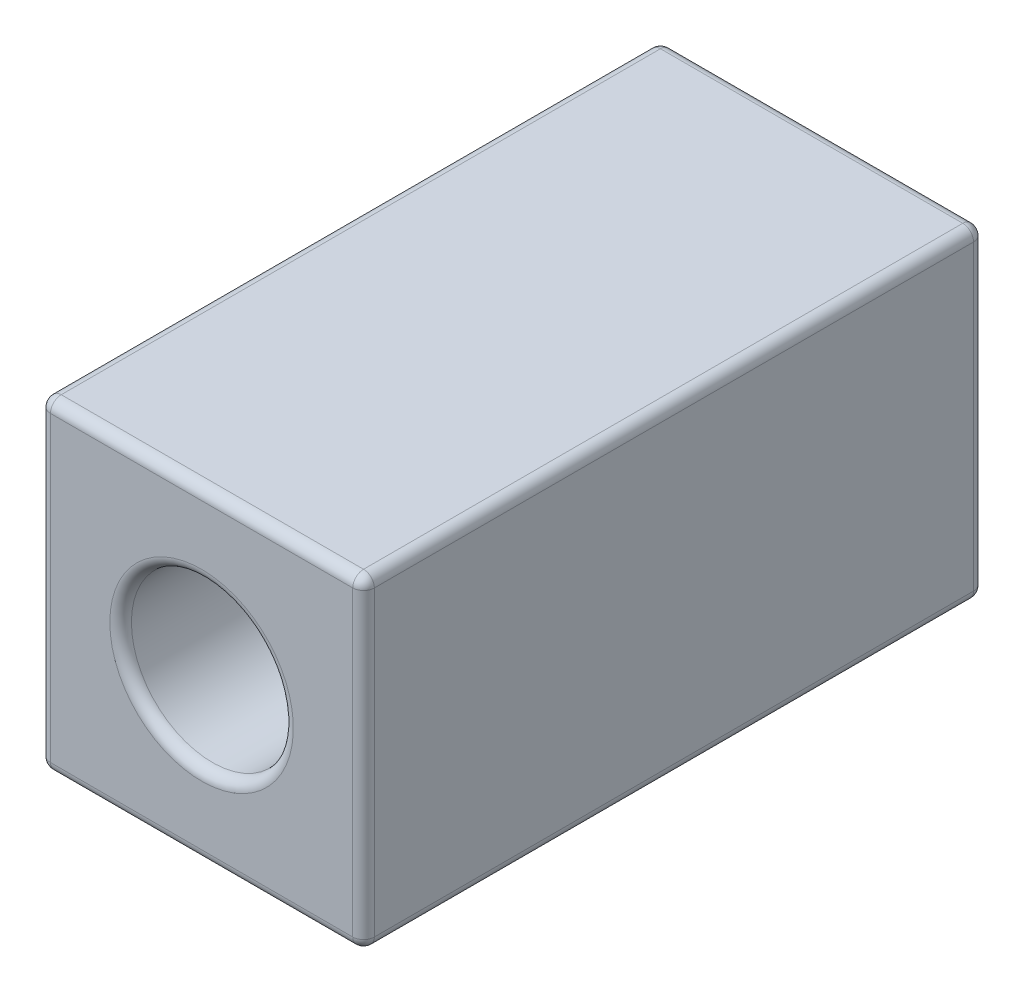
ISO-10303-21;
HEADER;
FILE_DESCRIPTION(('STEP AP214'),'2;1');
FILE_NAME('part.step','',(''),(''),'','','');
FILE_SCHEMA(('AUTOMOTIVE_DESIGN { 1 0 10303 214 1 1 1 1 }'));
ENDSEC;
DATA;
#1=APPLICATION_CONTEXT('core data for automotive mechanical design processes');
#2=APPLICATION_PROTOCOL_DEFINITION('international standard','automotive_design',2000,#1);
#3=PRODUCT_CONTEXT('',#1,'mechanical');
#4=PRODUCT('Part','Part','',(#3));
#5=PRODUCT_RELATED_PRODUCT_CATEGORY('part','',(#4));
#6=PRODUCT_DEFINITION_FORMATION('','',#4);
#7=PRODUCT_DEFINITION_CONTEXT('part definition',#1,'design');
#8=PRODUCT_DEFINITION('design','',#6,#7);
#9=PRODUCT_DEFINITION_SHAPE('','',#8);
#10=(LENGTH_UNIT() NAMED_UNIT(*) SI_UNIT(.MILLI.,.METRE.));
#11=(NAMED_UNIT(*) PLANE_ANGLE_UNIT() SI_UNIT($,.RADIAN.));
#12=(NAMED_UNIT(*) SI_UNIT($,.STERADIAN.) SOLID_ANGLE_UNIT());
#13=UNCERTAINTY_MEASURE_WITH_UNIT(LENGTH_MEASURE(1.E-05),#10,'distance_accuracy_value','');
#14=(GEOMETRIC_REPRESENTATION_CONTEXT(3) GLOBAL_UNCERTAINTY_ASSIGNED_CONTEXT((#13)) GLOBAL_UNIT_ASSIGNED_CONTEXT((#10,
#11,#12)) REPRESENTATION_CONTEXT('',''));
#15=CARTESIAN_POINT('',(0.,0.,0.));
#16=DIRECTION('',(0.,0.,1.));
#17=DIRECTION('',(1.,0.,0.));
#18=AXIS2_PLACEMENT_3D('',#15,#16,#17);
#19=CARTESIAN_POINT('',(-2.8,2.8,11.5));
#20=DIRECTION('',(0.,0.,-1.));
#21=DIRECTION('',(-1.,0.,0.));
#22=AXIS2_PLACEMENT_3D('',#19,#20,#21);
#23=PLANE('',#22);
#24=CARTESIAN_POINT('',(0.,0.,11.5));
#25=DIRECTION('',(0.,0.,-1.));
#26=DIRECTION('',(-1.,0.,0.));
#27=AXIS2_PLACEMENT_3D('',#24,#25,#26);
#28=CIRCLE('',#27,1.7);
#29=CARTESIAN_POINT('',(-1.7,0.,11.5));
#30=VERTEX_POINT('',#29);
#31=EDGE_CURVE('E11',#30,#30,#28,.T.);
#32=ORIENTED_EDGE('',*,*,#31,.T.);
#33=EDGE_LOOP('',(#32));
#34=FACE_BOUND('',#33,.T.);
#35=DIRECTION('',(0.,1.,0.));
#36=VECTOR('',#35,1.);
#37=CARTESIAN_POINT('',(2.8,2.8,11.5));
#38=LINE('',#37,#36);
#39=CARTESIAN_POINT('',(2.8,-2.8,11.5));
#40=VERTEX_POINT('',#39);
#41=CARTESIAN_POINT('',(2.8,2.8,11.5));
#42=VERTEX_POINT('',#41);
#43=EDGE_CURVE('E50',#40,#42,#38,.T.);
#44=ORIENTED_EDGE('',*,*,#43,.T.);
#45=DIRECTION('',(-1.,0.,0.));
#46=VECTOR('',#45,1.);
#47=CARTESIAN_POINT('',(-2.8,2.8,11.5));
#48=LINE('',#47,#46);
#49=CARTESIAN_POINT('',(-2.8,2.8,11.5));
#50=VERTEX_POINT('',#49);
#51=EDGE_CURVE('E43',#42,#50,#48,.T.);
#52=ORIENTED_EDGE('',*,*,#51,.T.);
#53=DIRECTION('',(0.,-1.,0.));
#54=VECTOR('',#53,1.);
#55=CARTESIAN_POINT('',(-2.8,2.8,11.5));
#56=LINE('',#55,#54);
#57=CARTESIAN_POINT('',(-2.8,-2.8,11.5));
#58=VERTEX_POINT('',#57);
#59=EDGE_CURVE('E205',#50,#58,#56,.T.);
#60=ORIENTED_EDGE('',*,*,#59,.T.);
#61=DIRECTION('',(1.,0.,0.));
#62=VECTOR('',#61,1.);
#63=CARTESIAN_POINT('',(-2.8,-2.8,11.5));
#64=LINE('',#63,#62);
#65=EDGE_CURVE('E55',#58,#40,#64,.T.);
#66=ORIENTED_EDGE('',*,*,#65,.T.);
#67=EDGE_LOOP('',(#44,#52,#60,#66));
#68=FACE_BOUND('',#67,.T.);
#69=ADVANCED_FACE('F35',(#34,#68),#23,.F.);
#70=CARTESIAN_POINT('',(-2.8,2.8,0.));
#71=DIRECTION('',(0.,0.,-1.));
#72=DIRECTION('',(-1.,0.,0.));
#73=AXIS2_PLACEMENT_3D('',#70,#71,#72);
#74=PLANE('',#73);
#75=CARTESIAN_POINT('',(0.,0.,0.));
#76=DIRECTION('',(0.,0.,-1.));
#77=DIRECTION('',(-1.,0.,0.));
#78=AXIS2_PLACEMENT_3D('',#75,#76,#77);
#79=CIRCLE('',#78,1.7);
#80=CARTESIAN_POINT('',(-1.7,0.,0.));
#81=VERTEX_POINT('',#80);
#82=EDGE_CURVE('E161',#81,#81,#79,.F.);
#83=ORIENTED_EDGE('',*,*,#82,.T.);
#84=EDGE_LOOP('',(#83));
#85=FACE_BOUND('',#84,.T.);
#86=DIRECTION('',(1.,0.,0.));
#87=VECTOR('',#86,1.);
#88=CARTESIAN_POINT('',(-2.8,-2.8,0.));
#89=LINE('',#88,#87);
#90=CARTESIAN_POINT('',(2.8,-2.8,0.));
#91=VERTEX_POINT('',#90);
#92=CARTESIAN_POINT('',(-2.8,-2.8,0.));
#93=VERTEX_POINT('',#92);
#94=EDGE_CURVE('E159',#91,#93,#89,.F.);
#95=ORIENTED_EDGE('',*,*,#94,.T.);
#96=DIRECTION('',(0.,-1.,0.));
#97=VECTOR('',#96,1.);
#98=CARTESIAN_POINT('',(-2.8,2.8,0.));
#99=LINE('',#98,#97);
#100=CARTESIAN_POINT('',(-2.8,2.8,0.));
#101=VERTEX_POINT('',#100);
#102=EDGE_CURVE('E129',#93,#101,#99,.F.);
#103=ORIENTED_EDGE('',*,*,#102,.T.);
#104=DIRECTION('',(-1.,0.,0.));
#105=VECTOR('',#104,1.);
#106=CARTESIAN_POINT('',(2.8,2.8,0.));
#107=LINE('',#106,#105);
#108=CARTESIAN_POINT('',(2.8,2.8,0.));
#109=VERTEX_POINT('',#108);
#110=EDGE_CURVE('E148',#101,#109,#107,.F.);
#111=ORIENTED_EDGE('',*,*,#110,.T.);
#112=DIRECTION('',(0.,1.,0.));
#113=VECTOR('',#112,1.);
#114=CARTESIAN_POINT('',(2.8,-2.8,0.));
#115=LINE('',#114,#113);
#116=EDGE_CURVE('E154',#109,#91,#115,.F.);
#117=ORIENTED_EDGE('',*,*,#116,.T.);
#118=EDGE_LOOP('',(#95,#103,#111,#117));
#119=FACE_BOUND('',#118,.T.);
#120=ADVANCED_FACE('F157',(#85,#119),#74,.T.);
#121=CARTESIAN_POINT('',(-2.8,2.8,11.5));
#122=DIRECTION('',(0.,0.,-1.));
#123=DIRECTION('',(-1.,0.,0.));
#124=AXIS2_PLACEMENT_3D('',#121,#122,#123);
#125=CYLINDRICAL_SURFACE('',#124,0.2);
#126=DIRECTION('',(0.,0.,-1.));
#127=VECTOR('',#126,1.);
#128=CARTESIAN_POINT('',(-2.8,3.,11.5));
#129=LINE('',#128,#127);
#130=CARTESIAN_POINT('',(-2.8,3.,11.3));
#131=VERTEX_POINT('',#130);
#132=CARTESIAN_POINT('',(-2.8,3.,0.200000000000001));
#133=VERTEX_POINT('',#132);
#134=EDGE_CURVE('E260',#131,#133,#129,.T.);
#135=ORIENTED_EDGE('',*,*,#134,.T.);
#136=CARTESIAN_POINT('',(-2.8,2.8,0.200000000000001));
#137=DIRECTION('',(0.,0.,-1.));
#138=DIRECTION('',(-1.,0.,0.));
#139=AXIS2_PLACEMENT_3D('',#136,#137,#138);
#140=CIRCLE('',#139,0.2);
#141=CARTESIAN_POINT('',(-3.,2.8,0.200000000000001));
#142=VERTEX_POINT('',#141);
#143=EDGE_CURVE('E142',#133,#142,#140,.F.);
#144=ORIENTED_EDGE('',*,*,#143,.T.);
#145=DIRECTION('',(0.,0.,-1.));
#146=VECTOR('',#145,1.);
#147=CARTESIAN_POINT('',(-3.,2.8,11.5));
#148=LINE('',#147,#146);
#149=CARTESIAN_POINT('',(-3.,2.8,11.3));
#150=VERTEX_POINT('',#149);
#151=EDGE_CURVE('E155',#150,#142,#148,.T.);
#152=ORIENTED_EDGE('',*,*,#151,.F.);
#153=CARTESIAN_POINT('',(-2.8,2.8,11.3));
#154=DIRECTION('',(0.,0.,-1.));
#155=DIRECTION('',(-1.,0.,0.));
#156=AXIS2_PLACEMENT_3D('',#153,#154,#155);
#157=CIRCLE('',#156,0.2);
#158=EDGE_CURVE('E202',#150,#131,#157,.T.);
#159=ORIENTED_EDGE('',*,*,#158,.T.);
#160=EDGE_LOOP('',(#135,#144,#152,#159));
#161=FACE_BOUND('',#160,.T.);
#162=ADVANCED_FACE('F37',(#161),#125,.T.);
#163=CARTESIAN_POINT('',(-3.,2.8,11.5));
#164=DIRECTION('',(1.,0.,0.));
#165=DIRECTION('',(0.,0.,-1.));
#166=AXIS2_PLACEMENT_3D('',#163,#164,#165);
#167=PLANE('',#166);
#168=ORIENTED_EDGE('',*,*,#151,.T.);
#169=DIRECTION('',(0.,-1.,0.));
#170=VECTOR('',#169,1.);
#171=CARTESIAN_POINT('',(-3.,-2.8,0.200000000000001));
#172=LINE('',#171,#170);
#173=CARTESIAN_POINT('',(-3.,-2.8,0.200000000000001));
#174=VERTEX_POINT('',#173);
#175=EDGE_CURVE('E132',#142,#174,#172,.T.);
#176=ORIENTED_EDGE('',*,*,#175,.T.);
#177=DIRECTION('',(0.,0.,-1.));
#178=VECTOR('',#177,1.);
#179=CARTESIAN_POINT('',(-3.,-2.8,11.5));
#180=LINE('',#179,#178);
#181=CARTESIAN_POINT('',(-3.,-2.8,11.3));
#182=VERTEX_POINT('',#181);
#183=EDGE_CURVE('E278',#182,#174,#180,.T.);
#184=ORIENTED_EDGE('',*,*,#183,.F.);
#185=DIRECTION('',(0.,-1.,0.));
#186=VECTOR('',#185,1.);
#187=CARTESIAN_POINT('',(-3.,2.8,11.3));
#188=LINE('',#187,#186);
#189=EDGE_CURVE('E174',#182,#150,#188,.F.);
#190=ORIENTED_EDGE('',*,*,#189,.T.);
#191=EDGE_LOOP('',(#168,#176,#184,#190));
#192=FACE_BOUND('',#191,.T.);
#193=ADVANCED_FACE('F301',(#192),#167,.F.);
#194=CARTESIAN_POINT('',(-2.8,-2.8,11.5));
#195=DIRECTION('',(0.,0.,-1.));
#196=DIRECTION('',(-1.,0.,0.));
#197=AXIS2_PLACEMENT_3D('',#194,#195,#196);
#198=CYLINDRICAL_SURFACE('',#197,0.2);
#199=ORIENTED_EDGE('',*,*,#183,.T.);
#200=CARTESIAN_POINT('',(-2.8,-2.8,0.200000000000001));
#201=DIRECTION('',(0.,0.,-1.));
#202=DIRECTION('',(-1.,0.,0.));
#203=AXIS2_PLACEMENT_3D('',#200,#201,#202);
#204=CIRCLE('',#203,0.2);
#205=CARTESIAN_POINT('',(-2.8,-3.,0.200000000000001));
#206=VERTEX_POINT('',#205);
#207=EDGE_CURVE('E179',#174,#206,#204,.F.);
#208=ORIENTED_EDGE('',*,*,#207,.T.);
#209=DIRECTION('',(0.,0.,-1.));
#210=VECTOR('',#209,1.);
#211=CARTESIAN_POINT('',(-2.8,-3.,11.5));
#212=LINE('',#211,#210);
#213=CARTESIAN_POINT('',(-2.8,-3.,11.3));
#214=VERTEX_POINT('',#213);
#215=EDGE_CURVE('E275',#214,#206,#212,.T.);
#216=ORIENTED_EDGE('',*,*,#215,.F.);
#217=CARTESIAN_POINT('',(-2.8,-2.8,11.3));
#218=DIRECTION('',(0.,0.,-1.));
#219=DIRECTION('',(-1.,0.,0.));
#220=AXIS2_PLACEMENT_3D('',#217,#218,#219);
#221=CIRCLE('',#220,0.2);
#222=EDGE_CURVE('E177',#214,#182,#221,.T.);
#223=ORIENTED_EDGE('',*,*,#222,.T.);
#224=EDGE_LOOP('',(#199,#208,#216,#223));
#225=FACE_BOUND('',#224,.T.);
#226=ADVANCED_FACE('F303',(#225),#198,.T.);
#227=CARTESIAN_POINT('',(-2.8,-3.,11.5));
#228=DIRECTION('',(0.,1.,0.));
#229=DIRECTION('',(0.,0.,1.));
#230=AXIS2_PLACEMENT_3D('',#227,#228,#229);
#231=PLANE('',#230);
#232=ORIENTED_EDGE('',*,*,#215,.T.);
#233=DIRECTION('',(1.,0.,0.));
#234=VECTOR('',#233,1.);
#235=CARTESIAN_POINT('',(2.8,-3.,0.200000000000001));
#236=LINE('',#235,#234);
#237=CARTESIAN_POINT('',(2.8,-3.,0.200000000000001));
#238=VERTEX_POINT('',#237);
#239=EDGE_CURVE('E183',#206,#238,#236,.T.);
#240=ORIENTED_EDGE('',*,*,#239,.T.);
#241=DIRECTION('',(0.,0.,-1.));
#242=VECTOR('',#241,1.);
#243=CARTESIAN_POINT('',(2.8,-3.,11.5));
#244=LINE('',#243,#242);
#245=CARTESIAN_POINT('',(2.8,-3.,11.3));
#246=VERTEX_POINT('',#245);
#247=EDGE_CURVE('E272',#246,#238,#244,.T.);
#248=ORIENTED_EDGE('',*,*,#247,.F.);
#249=DIRECTION('',(1.,0.,0.));
#250=VECTOR('',#249,1.);
#251=CARTESIAN_POINT('',(-2.8,-3.,11.3));
#252=LINE('',#251,#250);
#253=EDGE_CURVE('E181',#246,#214,#252,.F.);
#254=ORIENTED_EDGE('',*,*,#253,.T.);
#255=EDGE_LOOP('',(#232,#240,#248,#254));
#256=FACE_BOUND('',#255,.T.);
#257=ADVANCED_FACE('F356',(#256),#231,.F.);
#258=CARTESIAN_POINT('',(2.8,-2.8,11.5));
#259=DIRECTION('',(0.,0.,-1.));
#260=DIRECTION('',(-1.,0.,0.));
#261=AXIS2_PLACEMENT_3D('',#258,#259,#260);
#262=CYLINDRICAL_SURFACE('',#261,0.2);
#263=ORIENTED_EDGE('',*,*,#247,.T.);
#264=CARTESIAN_POINT('',(2.8,-2.8,0.200000000000001));
#265=DIRECTION('',(0.,0.,-1.));
#266=DIRECTION('',(-1.,0.,0.));
#267=AXIS2_PLACEMENT_3D('',#264,#265,#266);
#268=CIRCLE('',#267,0.2);
#269=CARTESIAN_POINT('',(3.,-2.8,0.200000000000001));
#270=VERTEX_POINT('',#269);
#271=EDGE_CURVE('E187',#238,#270,#268,.F.);
#272=ORIENTED_EDGE('',*,*,#271,.T.);
#273=DIRECTION('',(0.,0.,-1.));
#274=VECTOR('',#273,1.);
#275=CARTESIAN_POINT('',(3.,-2.8,11.5));
#276=LINE('',#275,#274);
#277=CARTESIAN_POINT('',(3.,-2.8,11.3));
#278=VERTEX_POINT('',#277);
#279=EDGE_CURVE('E269',#278,#270,#276,.T.);
#280=ORIENTED_EDGE('',*,*,#279,.F.);
#281=CARTESIAN_POINT('',(2.8,-2.8,11.3));
#282=DIRECTION('',(0.,0.,-1.));
#283=DIRECTION('',(-1.,0.,0.));
#284=AXIS2_PLACEMENT_3D('',#281,#282,#283);
#285=CIRCLE('',#284,0.2);
#286=EDGE_CURVE('E185',#278,#246,#285,.T.);
#287=ORIENTED_EDGE('',*,*,#286,.T.);
#288=EDGE_LOOP('',(#263,#272,#280,#287));
#289=FACE_BOUND('',#288,.T.);
#290=ADVANCED_FACE('F352',(#289),#262,.T.);
#291=CARTESIAN_POINT('',(3.,2.8,11.5));
#292=DIRECTION('',(-1.,0.,0.));
#293=DIRECTION('',(0.,0.,1.));
#294=AXIS2_PLACEMENT_3D('',#291,#292,#293);
#295=PLANE('',#294);
#296=ORIENTED_EDGE('',*,*,#279,.T.);
#297=DIRECTION('',(0.,1.,0.));
#298=VECTOR('',#297,1.);
#299=CARTESIAN_POINT('',(3.,2.8,0.200000000000001));
#300=LINE('',#299,#298);
#301=CARTESIAN_POINT('',(3.,2.8,0.200000000000001));
#302=VERTEX_POINT('',#301);
#303=EDGE_CURVE('E191',#270,#302,#300,.T.);
#304=ORIENTED_EDGE('',*,*,#303,.T.);
#305=DIRECTION('',(0.,0.,-1.));
#306=VECTOR('',#305,1.);
#307=CARTESIAN_POINT('',(3.,2.8,11.5));
#308=LINE('',#307,#306);
#309=CARTESIAN_POINT('',(3.,2.8,11.3));
#310=VERTEX_POINT('',#309);
#311=EDGE_CURVE('E266',#310,#302,#308,.T.);
#312=ORIENTED_EDGE('',*,*,#311,.F.);
#313=DIRECTION('',(0.,1.,0.));
#314=VECTOR('',#313,1.);
#315=CARTESIAN_POINT('',(3.,2.8,11.3));
#316=LINE('',#315,#314);
#317=EDGE_CURVE('E189',#310,#278,#316,.F.);
#318=ORIENTED_EDGE('',*,*,#317,.T.);
#319=EDGE_LOOP('',(#296,#304,#312,#318));
#320=FACE_BOUND('',#319,.T.);
#321=ADVANCED_FACE('F349',(#320),#295,.F.);
#322=CARTESIAN_POINT('',(2.8,2.8,11.5));
#323=DIRECTION('',(0.,0.,-1.));
#324=DIRECTION('',(-1.,0.,0.));
#325=AXIS2_PLACEMENT_3D('',#322,#323,#324);
#326=CYLINDRICAL_SURFACE('',#325,0.2);
#327=ORIENTED_EDGE('',*,*,#311,.T.);
#328=CARTESIAN_POINT('',(2.8,2.8,0.200000000000001));
#329=DIRECTION('',(0.,0.,-1.));
#330=DIRECTION('',(-1.,0.,0.));
#331=AXIS2_PLACEMENT_3D('',#328,#329,#330);
#332=CIRCLE('',#331,0.2);
#333=CARTESIAN_POINT('',(2.8,3.,0.200000000000001));
#334=VERTEX_POINT('',#333);
#335=EDGE_CURVE('E195',#302,#334,#332,.F.);
#336=ORIENTED_EDGE('',*,*,#335,.T.);
#337=DIRECTION('',(0.,0.,-1.));
#338=VECTOR('',#337,1.);
#339=CARTESIAN_POINT('',(2.8,3.,11.5));
#340=LINE('',#339,#338);
#341=CARTESIAN_POINT('',(2.8,3.,11.3));
#342=VERTEX_POINT('',#341);
#343=EDGE_CURVE('E263',#342,#334,#340,.T.);
#344=ORIENTED_EDGE('',*,*,#343,.F.);
#345=CARTESIAN_POINT('',(2.8,2.8,11.3));
#346=DIRECTION('',(0.,0.,-1.));
#347=DIRECTION('',(-1.,0.,0.));
#348=AXIS2_PLACEMENT_3D('',#345,#346,#347);
#349=CIRCLE('',#348,0.2);
#350=EDGE_CURVE('E193',#342,#310,#349,.T.);
#351=ORIENTED_EDGE('',*,*,#350,.T.);
#352=EDGE_LOOP('',(#327,#336,#344,#351));
#353=FACE_BOUND('',#352,.T.);
#354=ADVANCED_FACE('F325',(#353),#326,.T.);
#355=CARTESIAN_POINT('',(-2.8,3.,11.5));
#356=DIRECTION('',(0.,-1.,0.));
#357=DIRECTION('',(0.,0.,-1.));
#358=AXIS2_PLACEMENT_3D('',#355,#356,#357);
#359=PLANE('',#358);
#360=ORIENTED_EDGE('',*,*,#343,.T.);
#361=DIRECTION('',(-1.,0.,0.));
#362=VECTOR('',#361,1.);
#363=CARTESIAN_POINT('',(-2.8,3.,0.200000000000001));
#364=LINE('',#363,#362);
#365=EDGE_CURVE('E200',#334,#133,#364,.T.);
#366=ORIENTED_EDGE('',*,*,#365,.T.);
#367=ORIENTED_EDGE('',*,*,#134,.F.);
#368=DIRECTION('',(-1.,0.,0.));
#369=VECTOR('',#368,1.);
#370=CARTESIAN_POINT('',(-2.8,3.,11.3));
#371=LINE('',#370,#369);
#372=EDGE_CURVE('E197',#131,#342,#371,.F.);
#373=ORIENTED_EDGE('',*,*,#372,.T.);
#374=EDGE_LOOP('',(#360,#366,#367,#373));
#375=FACE_BOUND('',#374,.T.);
#376=ADVANCED_FACE('F324',(#375),#359,.F.);
#377=CARTESIAN_POINT('',(0.,0.,11.5));
#378=DIRECTION('',(0.,0.,-1.));
#379=DIRECTION('',(-1.,0.,0.));
#380=AXIS2_PLACEMENT_3D('',#377,#378,#379);
#381=CYLINDRICAL_SURFACE('',#380,1.5);
#382=CARTESIAN_POINT('',(0.,0.,0.200000000000001));
#383=DIRECTION('',(0.,0.,-1.));
#384=DIRECTION('',(-1.,0.,0.));
#385=AXIS2_PLACEMENT_3D('',#382,#383,#384);
#386=CIRCLE('',#385,1.5);
#387=CARTESIAN_POINT('',(-1.5,0.,0.200000000000001));
#388=VERTEX_POINT('',#387);
#389=EDGE_CURVE('E171',#388,#388,#386,.T.);
#390=ORIENTED_EDGE('',*,*,#389,.T.);
#391=EDGE_LOOP('',(#390));
#392=FACE_BOUND('',#391,.T.);
#393=CARTESIAN_POINT('',(0.,0.,11.3));
#394=DIRECTION('',(0.,0.,-1.));
#395=DIRECTION('',(-1.,0.,0.));
#396=AXIS2_PLACEMENT_3D('',#393,#394,#395);
#397=CIRCLE('',#396,1.5);
#398=CARTESIAN_POINT('',(-1.5,0.,11.3));
#399=VERTEX_POINT('',#398);
#400=EDGE_CURVE('E164',#399,#399,#397,.F.);
#401=ORIENTED_EDGE('',*,*,#400,.T.);
#402=EDGE_LOOP('',(#401));
#403=FACE_BOUND('',#402,.T.);
#404=ADVANCED_FACE('F346',(#392,#403),#381,.F.);
#405=CARTESIAN_POINT('',(0.,0.,0.200000000000001));
#406=DIRECTION('',(0.,0.,-1.));
#407=DIRECTION('',(-1.,0.,0.));
#408=AXIS2_PLACEMENT_3D('',#405,#406,#407);
#409=TOROIDAL_SURFACE('',#408,1.7,0.2);
#410=ORIENTED_EDGE('',*,*,#389,.F.);
#411=EDGE_LOOP('',(#410));
#412=FACE_BOUND('',#411,.T.);
#413=ORIENTED_EDGE('',*,*,#82,.F.);
#414=EDGE_LOOP('',(#413));
#415=FACE_BOUND('',#414,.T.);
#416=ADVANCED_FACE('F393',(#412,#415),#409,.T.);
#417=CARTESIAN_POINT('',(2.8,2.8,0.200000000000001));
#418=DIRECTION('',(0.,-1.,0.));
#419=DIRECTION('',(0.,0.,-1.));
#420=AXIS2_PLACEMENT_3D('',#417,#418,#419);
#421=CYLINDRICAL_SURFACE('',#420,0.2);
#422=CARTESIAN_POINT('',(2.8,2.8,0.200000000000001));
#423=DIRECTION('',(0.,1.,0.));
#424=DIRECTION('',(0.,0.,1.));
#425=AXIS2_PLACEMENT_3D('',#422,#423,#424);
#426=CIRCLE('',#425,0.2);
#427=EDGE_CURVE('E257',#302,#109,#426,.T.);
#428=ORIENTED_EDGE('',*,*,#427,.F.);
#429=ORIENTED_EDGE('',*,*,#303,.F.);
#430=CARTESIAN_POINT('',(2.8,-2.8,0.2));
#431=DIRECTION('',(0.,-1.,0.));
#432=DIRECTION('',(1.,0.,0.));
#433=AXIS2_PLACEMENT_3D('',#430,#431,#432);
#434=CIRCLE('',#433,0.2);
#435=EDGE_CURVE('E254',#91,#270,#434,.T.);
#436=ORIENTED_EDGE('',*,*,#435,.F.);
#437=ORIENTED_EDGE('',*,*,#116,.F.);
#438=EDGE_LOOP('',(#428,#429,#436,#437));
#439=FACE_BOUND('',#438,.T.);
#440=ADVANCED_FACE('F287',(#439),#421,.T.);
#441=CARTESIAN_POINT('',(2.8,2.8,0.200000000000001));
#442=DIRECTION('',(0.,0.,1.));
#443=DIRECTION('',(1.,0.,0.));
#444=AXIS2_PLACEMENT_3D('',#441,#442,#443);
#445=SPHERICAL_SURFACE('',#444,0.2);
#446=ORIENTED_EDGE('',*,*,#335,.F.);
#447=ORIENTED_EDGE('',*,*,#427,.T.);
#448=CARTESIAN_POINT('',(2.8,2.8,0.200000000000001));
#449=DIRECTION('',(-1.,0.,0.));
#450=DIRECTION('',(0.,-1.,0.));
#451=AXIS2_PLACEMENT_3D('',#448,#449,#450);
#452=CIRCLE('',#451,0.2);
#453=EDGE_CURVE('E151',#334,#109,#452,.T.);
#454=ORIENTED_EDGE('',*,*,#453,.F.);
#455=EDGE_LOOP('',(#446,#447,#454));
#456=FACE_BOUND('',#455,.T.);
#457=ADVANCED_FACE('F328',(#456),#445,.T.);
#458=CARTESIAN_POINT('',(2.8,-2.8,0.200000000000001));
#459=DIRECTION('',(0.,0.,1.));
#460=DIRECTION('',(1.,0.,0.));
#461=AXIS2_PLACEMENT_3D('',#458,#459,#460);
#462=SPHERICAL_SURFACE('',#461,0.2);
#463=ORIENTED_EDGE('',*,*,#435,.T.);
#464=ORIENTED_EDGE('',*,*,#271,.F.);
#465=CARTESIAN_POINT('',(2.8,-2.8,0.2));
#466=DIRECTION('',(-1.,0.,0.));
#467=DIRECTION('',(0.,-1.,0.));
#468=AXIS2_PLACEMENT_3D('',#465,#466,#467);
#469=CIRCLE('',#468,0.2);
#470=EDGE_CURVE('E145',#91,#238,#469,.T.);
#471=ORIENTED_EDGE('',*,*,#470,.F.);
#472=EDGE_LOOP('',(#463,#464,#471));
#473=FACE_BOUND('',#472,.T.);
#474=ADVANCED_FACE('F290',(#473),#462,.T.);
#475=CARTESIAN_POINT('',(-2.8,2.8,0.200000000000001));
#476=DIRECTION('',(1.,0.,0.));
#477=DIRECTION('',(0.,0.,-1.));
#478=AXIS2_PLACEMENT_3D('',#475,#476,#477);
#479=CYLINDRICAL_SURFACE('',#478,0.2);
#480=ORIENTED_EDGE('',*,*,#453,.T.);
#481=ORIENTED_EDGE('',*,*,#110,.F.);
#482=CARTESIAN_POINT('',(-2.8,2.8,0.200000000000001));
#483=DIRECTION('',(-1.,0.,0.));
#484=DIRECTION('',(0.,0.,1.));
#485=AXIS2_PLACEMENT_3D('',#482,#483,#484);
#486=CIRCLE('',#485,0.2);
#487=EDGE_CURVE('E139',#133,#101,#486,.T.);
#488=ORIENTED_EDGE('',*,*,#487,.F.);
#489=ORIENTED_EDGE('',*,*,#365,.F.);
#490=EDGE_LOOP('',(#480,#481,#488,#489));
#491=FACE_BOUND('',#490,.T.);
#492=ADVANCED_FACE('F149',(#491),#479,.T.);
#493=CARTESIAN_POINT('',(-2.8,-2.8,0.200000000000001));
#494=DIRECTION('',(-1.,0.,0.));
#495=DIRECTION('',(0.,0.,1.));
#496=AXIS2_PLACEMENT_3D('',#493,#494,#495);
#497=CYLINDRICAL_SURFACE('',#496,0.2);
#498=ORIENTED_EDGE('',*,*,#470,.T.);
#499=ORIENTED_EDGE('',*,*,#239,.F.);
#500=CARTESIAN_POINT('',(-2.8,-2.8,0.2));
#501=DIRECTION('',(-1.,0.,0.));
#502=DIRECTION('',(0.,-1.,0.));
#503=AXIS2_PLACEMENT_3D('',#500,#501,#502);
#504=CIRCLE('',#503,0.2);
#505=EDGE_CURVE('E135',#93,#206,#504,.T.);
#506=ORIENTED_EDGE('',*,*,#505,.F.);
#507=ORIENTED_EDGE('',*,*,#94,.F.);
#508=EDGE_LOOP('',(#498,#499,#506,#507));
#509=FACE_BOUND('',#508,.T.);
#510=ADVANCED_FACE('F293',(#509),#497,.T.);
#511=CARTESIAN_POINT('',(-2.8,2.8,0.200000000000001));
#512=DIRECTION('',(0.,0.,1.));
#513=DIRECTION('',(1.,0.,0.));
#514=AXIS2_PLACEMENT_3D('',#511,#512,#513);
#515=SPHERICAL_SURFACE('',#514,0.2);
#516=ORIENTED_EDGE('',*,*,#143,.F.);
#517=ORIENTED_EDGE('',*,*,#487,.T.);
#518=CARTESIAN_POINT('',(-2.8,2.8,0.200000000000001));
#519=DIRECTION('',(0.,-1.,0.));
#520=DIRECTION('',(1.,0.,0.));
#521=AXIS2_PLACEMENT_3D('',#518,#519,#520);
#522=CIRCLE('',#521,0.2);
#523=EDGE_CURVE('E125',#142,#101,#522,.T.);
#524=ORIENTED_EDGE('',*,*,#523,.F.);
#525=EDGE_LOOP('',(#516,#517,#524));
#526=FACE_BOUND('',#525,.T.);
#527=ADVANCED_FACE('F141',(#526),#515,.T.);
#528=CARTESIAN_POINT('',(-2.8,-2.8,0.200000000000001));
#529=DIRECTION('',(0.,0.,1.));
#530=DIRECTION('',(1.,0.,0.));
#531=AXIS2_PLACEMENT_3D('',#528,#529,#530);
#532=SPHERICAL_SURFACE('',#531,0.2);
#533=ORIENTED_EDGE('',*,*,#505,.T.);
#534=ORIENTED_EDGE('',*,*,#207,.F.);
#535=CARTESIAN_POINT('',(-2.8,-2.8,0.2));
#536=DIRECTION('',(0.,1.,0.));
#537=DIRECTION('',(-1.,0.,0.));
#538=AXIS2_PLACEMENT_3D('',#535,#536,#537);
#539=CIRCLE('',#538,0.2);
#540=EDGE_CURVE('E136',#93,#174,#539,.T.);
#541=ORIENTED_EDGE('',*,*,#540,.F.);
#542=EDGE_LOOP('',(#533,#534,#541));
#543=FACE_BOUND('',#542,.T.);
#544=ADVANCED_FACE('F296',(#543),#532,.T.);
#545=CARTESIAN_POINT('',(-2.8,2.8,0.200000000000001));
#546=DIRECTION('',(0.,1.,0.));
#547=DIRECTION('',(0.,0.,1.));
#548=AXIS2_PLACEMENT_3D('',#545,#546,#547);
#549=CYLINDRICAL_SURFACE('',#548,0.2);
#550=ORIENTED_EDGE('',*,*,#523,.T.);
#551=ORIENTED_EDGE('',*,*,#102,.F.);
#552=ORIENTED_EDGE('',*,*,#540,.T.);
#553=ORIENTED_EDGE('',*,*,#175,.F.);
#554=EDGE_LOOP('',(#550,#551,#552,#553));
#555=FACE_BOUND('',#554,.T.);
#556=ADVANCED_FACE('F127',(#555),#549,.T.);
#557=CARTESIAN_POINT('',(0.,0.,11.3));
#558=DIRECTION('',(0.,0.,-1.));
#559=DIRECTION('',(-1.,0.,0.));
#560=AXIS2_PLACEMENT_3D('',#557,#558,#559);
#561=TOROIDAL_SURFACE('',#560,1.7,0.2);
#562=ORIENTED_EDGE('',*,*,#31,.F.);
#563=EDGE_LOOP('',(#562));
#564=FACE_BOUND('',#563,.T.);
#565=ORIENTED_EDGE('',*,*,#400,.F.);
#566=EDGE_LOOP('',(#565));
#567=FACE_BOUND('',#566,.T.);
#568=ADVANCED_FACE('F449',(#564,#567),#561,.T.);
#569=CARTESIAN_POINT('',(-2.8,-2.8,11.3));
#570=DIRECTION('',(1.,0.,0.));
#571=DIRECTION('',(0.,0.,-1.));
#572=AXIS2_PLACEMENT_3D('',#569,#570,#571);
#573=CYLINDRICAL_SURFACE('',#572,0.2);
#574=CARTESIAN_POINT('',(-2.8,-2.8,11.3));
#575=DIRECTION('',(-1.,0.,0.));
#576=DIRECTION('',(0.,0.,1.));
#577=AXIS2_PLACEMENT_3D('',#574,#575,#576);
#578=CIRCLE('',#577,0.2);
#579=EDGE_CURVE('E239',#214,#58,#578,.T.);
#580=ORIENTED_EDGE('',*,*,#579,.F.);
#581=ORIENTED_EDGE('',*,*,#253,.F.);
#582=CARTESIAN_POINT('',(2.8,-2.8,11.3));
#583=DIRECTION('',(1.,0.,0.));
#584=DIRECTION('',(0.,1.,0.));
#585=AXIS2_PLACEMENT_3D('',#582,#583,#584);
#586=CIRCLE('',#585,0.2);
#587=EDGE_CURVE('E245',#40,#246,#586,.T.);
#588=ORIENTED_EDGE('',*,*,#587,.F.);
#589=ORIENTED_EDGE('',*,*,#65,.F.);
#590=EDGE_LOOP('',(#580,#581,#588,#589));
#591=FACE_BOUND('',#590,.T.);
#592=ADVANCED_FACE('F308',(#591),#573,.T.);
#593=CARTESIAN_POINT('',(2.8,-2.8,11.3));
#594=DIRECTION('',(0.,0.,1.));
#595=DIRECTION('',(1.,0.,0.));
#596=AXIS2_PLACEMENT_3D('',#593,#594,#595);
#597=SPHERICAL_SURFACE('',#596,0.2);
#598=ORIENTED_EDGE('',*,*,#587,.T.);
#599=ORIENTED_EDGE('',*,*,#286,.F.);
#600=CARTESIAN_POINT('',(2.8,-2.8,11.3));
#601=DIRECTION('',(0.,1.,0.));
#602=DIRECTION('',(-1.,0.,0.));
#603=AXIS2_PLACEMENT_3D('',#600,#601,#602);
#604=CIRCLE('',#603,0.2);
#605=EDGE_CURVE('E236',#40,#278,#604,.T.);
#606=ORIENTED_EDGE('',*,*,#605,.F.);
#607=EDGE_LOOP('',(#598,#599,#606));
#608=FACE_BOUND('',#607,.T.);
#609=ADVANCED_FACE('F312',(#608),#597,.T.);
#610=CARTESIAN_POINT('',(-2.8,-2.8,11.3));
#611=DIRECTION('',(0.,0.,1.));
#612=DIRECTION('',(1.,0.,0.));
#613=AXIS2_PLACEMENT_3D('',#610,#611,#612);
#614=SPHERICAL_SURFACE('',#613,0.2);
#615=ORIENTED_EDGE('',*,*,#222,.F.);
#616=ORIENTED_EDGE('',*,*,#579,.T.);
#617=CARTESIAN_POINT('',(-2.8,-2.8,11.3));
#618=DIRECTION('',(0.,1.,0.));
#619=DIRECTION('',(-1.,0.,0.));
#620=AXIS2_PLACEMENT_3D('',#617,#618,#619);
#621=CIRCLE('',#620,0.2);
#622=EDGE_CURVE('E232',#182,#58,#621,.T.);
#623=ORIENTED_EDGE('',*,*,#622,.F.);
#624=EDGE_LOOP('',(#615,#616,#623));
#625=FACE_BOUND('',#624,.T.);
#626=ADVANCED_FACE('F305',(#625),#614,.T.);
#627=CARTESIAN_POINT('',(2.8,2.8,11.3));
#628=DIRECTION('',(0.,1.,0.));
#629=DIRECTION('',(0.,0.,1.));
#630=AXIS2_PLACEMENT_3D('',#627,#628,#629);
#631=CYLINDRICAL_SURFACE('',#630,0.2);
#632=ORIENTED_EDGE('',*,*,#605,.T.);
#633=ORIENTED_EDGE('',*,*,#317,.F.);
#634=CARTESIAN_POINT('',(2.8,2.8,11.3));
#635=DIRECTION('',(0.,1.,0.));
#636=DIRECTION('',(-1.,0.,0.));
#637=AXIS2_PLACEMENT_3D('',#634,#635,#636);
#638=CIRCLE('',#637,0.2);
#639=EDGE_CURVE('E227',#42,#310,#638,.T.);
#640=ORIENTED_EDGE('',*,*,#639,.F.);
#641=ORIENTED_EDGE('',*,*,#43,.F.);
#642=EDGE_LOOP('',(#632,#633,#640,#641));
#643=FACE_BOUND('',#642,.T.);
#644=ADVANCED_FACE('F315',(#643),#631,.T.);
#645=CARTESIAN_POINT('',(-2.8,2.8,11.3));
#646=DIRECTION('',(0.,-1.,0.));
#647=DIRECTION('',(0.,0.,-1.));
#648=AXIS2_PLACEMENT_3D('',#645,#646,#647);
#649=CYLINDRICAL_SURFACE('',#648,0.2);
#650=ORIENTED_EDGE('',*,*,#622,.T.);
#651=ORIENTED_EDGE('',*,*,#59,.F.);
#652=CARTESIAN_POINT('',(-2.8,2.8,11.3));
#653=DIRECTION('',(0.,1.,0.));
#654=DIRECTION('',(0.,0.,1.));
#655=AXIS2_PLACEMENT_3D('',#652,#653,#654);
#656=CIRCLE('',#655,0.2);
#657=EDGE_CURVE('E223',#150,#50,#656,.T.);
#658=ORIENTED_EDGE('',*,*,#657,.F.);
#659=ORIENTED_EDGE('',*,*,#189,.F.);
#660=EDGE_LOOP('',(#650,#651,#658,#659));
#661=FACE_BOUND('',#660,.T.);
#662=ADVANCED_FACE('F230',(#661),#649,.T.);
#663=CARTESIAN_POINT('',(2.8,2.8,11.3));
#664=DIRECTION('',(0.,0.,1.));
#665=DIRECTION('',(1.,0.,0.));
#666=AXIS2_PLACEMENT_3D('',#663,#664,#665);
#667=SPHERICAL_SURFACE('',#666,0.2);
#668=ORIENTED_EDGE('',*,*,#639,.T.);
#669=ORIENTED_EDGE('',*,*,#350,.F.);
#670=CARTESIAN_POINT('',(2.8,2.8,11.3));
#671=DIRECTION('',(-1.,0.,0.));
#672=DIRECTION('',(0.,-1.,0.));
#673=AXIS2_PLACEMENT_3D('',#670,#671,#672);
#674=CIRCLE('',#673,0.2);
#675=EDGE_CURVE('E214',#42,#342,#674,.T.);
#676=ORIENTED_EDGE('',*,*,#675,.F.);
#677=EDGE_LOOP('',(#668,#669,#676));
#678=FACE_BOUND('',#677,.T.);
#679=ADVANCED_FACE('F317',(#678),#667,.T.);
#680=CARTESIAN_POINT('',(-2.8,2.8,11.3));
#681=DIRECTION('',(0.,0.,1.));
#682=DIRECTION('',(1.,0.,0.));
#683=AXIS2_PLACEMENT_3D('',#680,#681,#682);
#684=SPHERICAL_SURFACE('',#683,0.2);
#685=ORIENTED_EDGE('',*,*,#158,.F.);
#686=ORIENTED_EDGE('',*,*,#657,.T.);
#687=CARTESIAN_POINT('',(-2.8,2.8,11.3));
#688=DIRECTION('',(1.,0.,0.));
#689=DIRECTION('',(0.,1.,0.));
#690=AXIS2_PLACEMENT_3D('',#687,#688,#689);
#691=CIRCLE('',#690,0.2);
#692=EDGE_CURVE('E217',#131,#50,#691,.T.);
#693=ORIENTED_EDGE('',*,*,#692,.F.);
#694=EDGE_LOOP('',(#685,#686,#693));
#695=FACE_BOUND('',#694,.T.);
#696=ADVANCED_FACE('F224',(#695),#684,.T.);
#697=CARTESIAN_POINT('',(-2.8,2.8,11.3));
#698=DIRECTION('',(-1.,0.,0.));
#699=DIRECTION('',(0.,0.,1.));
#700=AXIS2_PLACEMENT_3D('',#697,#698,#699);
#701=CYLINDRICAL_SURFACE('',#700,0.2);
#702=ORIENTED_EDGE('',*,*,#675,.T.);
#703=ORIENTED_EDGE('',*,*,#372,.F.);
#704=ORIENTED_EDGE('',*,*,#692,.T.);
#705=ORIENTED_EDGE('',*,*,#51,.F.);
#706=EDGE_LOOP('',(#702,#703,#704,#705));
#707=FACE_BOUND('',#706,.T.);
#708=ADVANCED_FACE('F211',(#707),#701,.T.);
#709=CLOSED_SHELL('',(#69,#120,#162,#193,#226,#257,#290,#321,#354,#376,#404,#416,#440,#457,#474,
#492,#510,#527,#544,#556,#568,#592,#609,#626,#644,#662,#679,#696,#708));
#710=MANIFOLD_SOLID_BREP('B2',#709);
#711=ADVANCED_BREP_SHAPE_REPRESENTATION('',(#18,#710),#14);
#712=SHAPE_DEFINITION_REPRESENTATION(#9,#711);
ENDSEC;
END-ISO-10303-21;
